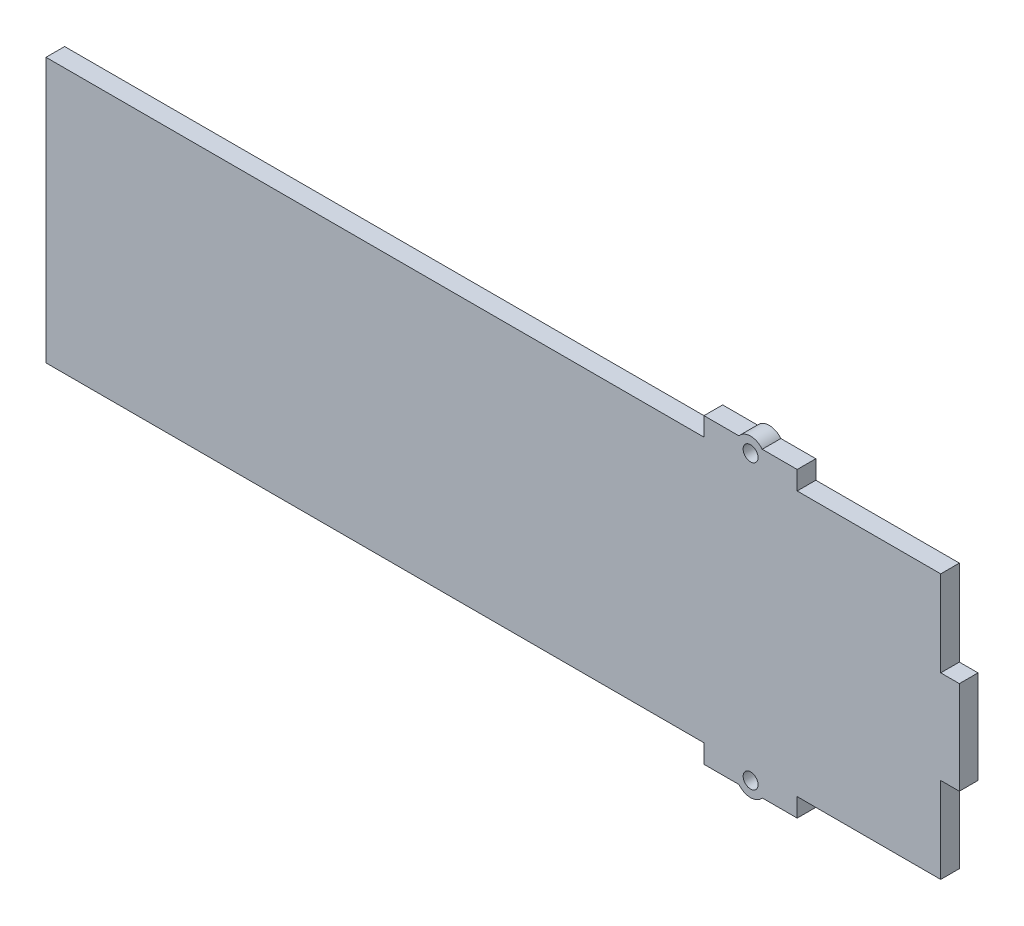
ISO-10303-21;
HEADER;
FILE_DESCRIPTION(('STEP AP214'),'2;1');
FILE_NAME('part.step','',(''),(''),'','','');
FILE_SCHEMA(('AUTOMOTIVE_DESIGN { 1 0 10303 214 1 1 1 1 }'));
ENDSEC;
DATA;
#1=APPLICATION_CONTEXT('core data for automotive mechanical design processes');
#2=APPLICATION_PROTOCOL_DEFINITION('international standard','automotive_design',2000,#1);
#3=PRODUCT_CONTEXT('',#1,'mechanical');
#4=PRODUCT('Part','Part','',(#3));
#5=PRODUCT_RELATED_PRODUCT_CATEGORY('part','',(#4));
#6=PRODUCT_DEFINITION_FORMATION('','',#4);
#7=PRODUCT_DEFINITION_CONTEXT('part definition',#1,'design');
#8=PRODUCT_DEFINITION('design','',#6,#7);
#9=PRODUCT_DEFINITION_SHAPE('','',#8);
#10=(LENGTH_UNIT() NAMED_UNIT(*) SI_UNIT(.MILLI.,.METRE.));
#11=(NAMED_UNIT(*) PLANE_ANGLE_UNIT() SI_UNIT($,.RADIAN.));
#12=(NAMED_UNIT(*) SI_UNIT($,.STERADIAN.) SOLID_ANGLE_UNIT());
#13=UNCERTAINTY_MEASURE_WITH_UNIT(LENGTH_MEASURE(1.E-05),#10,'distance_accuracy_value','');
#14=(GEOMETRIC_REPRESENTATION_CONTEXT(3) GLOBAL_UNCERTAINTY_ASSIGNED_CONTEXT((#13)) GLOBAL_UNIT_ASSIGNED_CONTEXT((#10,
#11,#12)) REPRESENTATION_CONTEXT('',''));
#15=CARTESIAN_POINT('',(0.,0.,0.));
#16=DIRECTION('',(0.,0.,1.));
#17=DIRECTION('',(1.,0.,0.));
#18=AXIS2_PLACEMENT_3D('',#15,#16,#17);
#19=CARTESIAN_POINT('',(12.5,-40.5,0.));
#20=DIRECTION('',(0.,-1.,0.));
#21=DIRECTION('',(0.,0.,-1.));
#22=AXIS2_PLACEMENT_3D('',#19,#20,#21);
#23=PLANE('',#22);
#24=DIRECTION('',(0.,0.,1.));
#25=VECTOR('',#24,1.);
#26=CARTESIAN_POINT('',(3.1224989991992,-40.5,0.));
#27=LINE('',#26,#25);
#28=CARTESIAN_POINT('',(3.1224989991992,-40.5,0.));
#29=VERTEX_POINT('',#28);
#30=CARTESIAN_POINT('',(3.1224989991992,-40.5,5.));
#31=VERTEX_POINT('',#30);
#32=EDGE_CURVE('E11',#29,#31,#27,.T.);
#33=ORIENTED_EDGE('',*,*,#32,.F.);
#34=DIRECTION('',(1.,0.,0.));
#35=VECTOR('',#34,1.);
#36=CARTESIAN_POINT('',(12.5,-40.5,0.));
#37=LINE('',#36,#35);
#38=CARTESIAN_POINT('',(12.5,-40.5,0.));
#39=VERTEX_POINT('',#38);
#40=EDGE_CURVE('E227',#29,#39,#37,.T.);
#41=ORIENTED_EDGE('',*,*,#40,.T.);
#42=DIRECTION('',(0.,0.,1.));
#43=VECTOR('',#42,1.);
#44=CARTESIAN_POINT('',(12.5,-40.5,0.));
#45=LINE('',#44,#43);
#46=CARTESIAN_POINT('',(12.5,-40.5,5.));
#47=VERTEX_POINT('',#46);
#48=EDGE_CURVE('E239',#39,#47,#45,.T.);
#49=ORIENTED_EDGE('',*,*,#48,.T.);
#50=DIRECTION('',(1.,0.,0.));
#51=VECTOR('',#50,1.);
#52=CARTESIAN_POINT('',(12.5,-40.5,5.));
#53=LINE('',#52,#51);
#54=EDGE_CURVE('E237',#31,#47,#53,.T.);
#55=ORIENTED_EDGE('',*,*,#54,.F.);
#56=EDGE_LOOP('',(#33,#41,#49,#55));
#57=FACE_BOUND('',#56,.T.);
#58=ADVANCED_FACE('F33',(#57),#23,.T.);
#59=CARTESIAN_POINT('',(-12.5,40.5,0.));
#60=DIRECTION('',(0.,1.,0.));
#61=DIRECTION('',(0.,0.,1.));
#62=AXIS2_PLACEMENT_3D('',#59,#60,#61);
#63=PLANE('',#62);
#64=DIRECTION('',(0.,0.,1.));
#65=VECTOR('',#64,1.);
#66=CARTESIAN_POINT('',(-3.1224989991992,40.5,0.));
#67=LINE('',#66,#65);
#68=CARTESIAN_POINT('',(-3.1224989991992,40.5,0.));
#69=VERTEX_POINT('',#68);
#70=CARTESIAN_POINT('',(-3.1224989991992,40.5,5.));
#71=VERTEX_POINT('',#70);
#72=EDGE_CURVE('E327',#69,#71,#67,.T.);
#73=ORIENTED_EDGE('',*,*,#72,.F.);
#74=DIRECTION('',(-1.,0.,0.));
#75=VECTOR('',#74,1.);
#76=CARTESIAN_POINT('',(-12.5,40.5,0.));
#77=LINE('',#76,#75);
#78=CARTESIAN_POINT('',(-12.5,40.5,0.));
#79=VERTEX_POINT('',#78);
#80=EDGE_CURVE('E281',#69,#79,#77,.T.);
#81=ORIENTED_EDGE('',*,*,#80,.T.);
#82=DIRECTION('',(0.,0.,1.));
#83=VECTOR('',#82,1.);
#84=CARTESIAN_POINT('',(-12.5,40.5,0.));
#85=LINE('',#84,#83);
#86=CARTESIAN_POINT('',(-12.5,40.5,5.));
#87=VERTEX_POINT('',#86);
#88=EDGE_CURVE('E292',#79,#87,#85,.T.);
#89=ORIENTED_EDGE('',*,*,#88,.T.);
#90=DIRECTION('',(-1.,0.,0.));
#91=VECTOR('',#90,1.);
#92=CARTESIAN_POINT('',(-12.5,40.5,5.));
#93=LINE('',#92,#91);
#94=EDGE_CURVE('E290',#71,#87,#93,.T.);
#95=ORIENTED_EDGE('',*,*,#94,.F.);
#96=EDGE_LOOP('',(#73,#81,#89,#95));
#97=FACE_BOUND('',#96,.T.);
#98=ADVANCED_FACE('F353',(#97),#63,.T.);
#99=CARTESIAN_POINT('',(-51.,-35.5,5.));
#100=DIRECTION('',(0.,1.,0.));
#101=DIRECTION('',(0.,0.,1.));
#102=AXIS2_PLACEMENT_3D('',#99,#100,#101);
#103=PLANE('',#102);
#104=DIRECTION('',(0.,0.,1.));
#105=VECTOR('',#104,1.);
#106=CARTESIAN_POINT('',(12.5,-35.5,0.));
#107=LINE('',#106,#105);
#108=CARTESIAN_POINT('',(12.5,-35.5,0.));
#109=VERTEX_POINT('',#108);
#110=CARTESIAN_POINT('',(12.5,-35.5,5.));
#111=VERTEX_POINT('',#110);
#112=EDGE_CURVE('E231',#109,#111,#107,.T.);
#113=ORIENTED_EDGE('',*,*,#112,.F.);
#114=DIRECTION('',(1.,0.,0.));
#115=VECTOR('',#114,1.);
#116=CARTESIAN_POINT('',(-51.,-35.5,0.));
#117=LINE('',#116,#115);
#118=CARTESIAN_POINT('',(51.,-35.5,0.));
#119=VERTEX_POINT('',#118);
#120=EDGE_CURVE('E295',#109,#119,#117,.T.);
#121=ORIENTED_EDGE('',*,*,#120,.T.);
#122=DIRECTION('',(0.,0.,-1.));
#123=VECTOR('',#122,1.);
#124=CARTESIAN_POINT('',(51.,-35.5,5.));
#125=LINE('',#124,#123);
#126=CARTESIAN_POINT('',(51.,-35.5,5.));
#127=VERTEX_POINT('',#126);
#128=EDGE_CURVE('E322',#127,#119,#125,.T.);
#129=ORIENTED_EDGE('',*,*,#128,.F.);
#130=DIRECTION('',(1.,0.,0.));
#131=VECTOR('',#130,1.);
#132=CARTESIAN_POINT('',(-51.,-35.5,5.));
#133=LINE('',#132,#131);
#134=EDGE_CURVE('E306',#111,#127,#133,.T.);
#135=ORIENTED_EDGE('',*,*,#134,.F.);
#136=EDGE_LOOP('',(#113,#121,#129,#135));
#137=FACE_BOUND('',#136,.T.);
#138=ADVANCED_FACE('F393',(#137),#103,.F.);
#139=CARTESIAN_POINT('',(51.,35.5,5.));
#140=DIRECTION('',(-1.,0.,0.));
#141=DIRECTION('',(0.,-1.,0.));
#142=AXIS2_PLACEMENT_3D('',#139,#140,#141);
#143=PLANE('',#142);
#144=DIRECTION('',(0.,0.,1.));
#145=VECTOR('',#144,1.);
#146=CARTESIAN_POINT('',(51.,12.5,0.));
#147=LINE('',#146,#145);
#148=CARTESIAN_POINT('',(51.,12.5,0.));
#149=VERTEX_POINT('',#148);
#150=CARTESIAN_POINT('',(51.,12.5,5.));
#151=VERTEX_POINT('',#150);
#152=EDGE_CURVE('E266',#149,#151,#147,.T.);
#153=ORIENTED_EDGE('',*,*,#152,.F.);
#154=DIRECTION('',(0.,1.,0.));
#155=VECTOR('',#154,1.);
#156=CARTESIAN_POINT('',(51.,35.5,0.));
#157=LINE('',#156,#155);
#158=CARTESIAN_POINT('',(51.,35.5,0.));
#159=VERTEX_POINT('',#158);
#160=EDGE_CURVE('E316',#149,#159,#157,.T.);
#161=ORIENTED_EDGE('',*,*,#160,.T.);
#162=DIRECTION('',(0.,0.,-1.));
#163=VECTOR('',#162,1.);
#164=CARTESIAN_POINT('',(51.,35.5,5.));
#165=LINE('',#164,#163);
#166=CARTESIAN_POINT('',(51.,35.5,5.));
#167=VERTEX_POINT('',#166);
#168=EDGE_CURVE('E314',#167,#159,#165,.T.);
#169=ORIENTED_EDGE('',*,*,#168,.F.);
#170=DIRECTION('',(0.,1.,0.));
#171=VECTOR('',#170,1.);
#172=CARTESIAN_POINT('',(51.,35.5,5.));
#173=LINE('',#172,#171);
#174=EDGE_CURVE('E305',#151,#167,#173,.T.);
#175=ORIENTED_EDGE('',*,*,#174,.F.);
#176=EDGE_LOOP('',(#153,#161,#169,#175));
#177=FACE_BOUND('',#176,.T.);
#178=ADVANCED_FACE('F373',(#177),#143,.F.);
#179=CARTESIAN_POINT('',(-51.,35.5,5.));
#180=DIRECTION('',(0.,-1.,0.));
#181=DIRECTION('',(1.,0.,0.));
#182=AXIS2_PLACEMENT_3D('',#179,#180,#181);
#183=PLANE('',#182);
#184=DIRECTION('',(0.,0.,1.));
#185=VECTOR('',#184,1.);
#186=CARTESIAN_POINT('',(-12.5,35.5,0.));
#187=LINE('',#186,#185);
#188=CARTESIAN_POINT('',(-12.5,35.5,0.));
#189=VERTEX_POINT('',#188);
#190=CARTESIAN_POINT('',(-12.5,35.5,5.));
#191=VERTEX_POINT('',#190);
#192=EDGE_CURVE('E175',#189,#191,#187,.T.);
#193=ORIENTED_EDGE('',*,*,#192,.F.);
#194=DIRECTION('',(-1.,0.,0.));
#195=VECTOR('',#194,1.);
#196=CARTESIAN_POINT('',(-51.,35.5,0.));
#197=LINE('',#196,#195);
#198=CARTESIAN_POINT('',(-189.,35.5,0.));
#199=VERTEX_POINT('',#198);
#200=EDGE_CURVE('E169',#189,#199,#197,.T.);
#201=ORIENTED_EDGE('',*,*,#200,.T.);
#202=DIRECTION('',(0.,0.,1.));
#203=VECTOR('',#202,1.);
#204=CARTESIAN_POINT('',(-189.,35.5,0.));
#205=LINE('',#204,#203);
#206=CARTESIAN_POINT('',(-189.,35.5,5.));
#207=VERTEX_POINT('',#206);
#208=EDGE_CURVE('E173',#199,#207,#205,.T.);
#209=ORIENTED_EDGE('',*,*,#208,.T.);
#210=DIRECTION('',(-1.,0.,0.));
#211=VECTOR('',#210,1.);
#212=CARTESIAN_POINT('',(-51.,35.5,5.));
#213=LINE('',#212,#211);
#214=EDGE_CURVE('E310',#191,#207,#213,.T.);
#215=ORIENTED_EDGE('',*,*,#214,.F.);
#216=EDGE_LOOP('',(#193,#201,#209,#215));
#217=FACE_BOUND('',#216,.T.);
#218=ADVANCED_FACE('F171',(#217),#183,.F.);
#219=CARTESIAN_POINT('',(-189.,-35.5,0.));
#220=VERTEX_POINT('',#219);
#221=CARTESIAN_POINT('',(-12.5,-35.5,0.));
#222=VERTEX_POINT('',#221);
#223=EDGE_CURVE('E196',#220,#222,#117,.T.);
#224=ORIENTED_EDGE('',*,*,#223,.T.);
#225=DIRECTION('',(0.,0.,1.));
#226=VECTOR('',#225,1.);
#227=CARTESIAN_POINT('',(-12.5,-35.5,0.));
#228=LINE('',#227,#226);
#229=CARTESIAN_POINT('',(-12.5,-35.5,5.));
#230=VERTEX_POINT('',#229);
#231=EDGE_CURVE('E245',#222,#230,#228,.T.);
#232=ORIENTED_EDGE('',*,*,#231,.T.);
#233=CARTESIAN_POINT('',(-189.,-35.5,5.));
#234=VERTEX_POINT('',#233);
#235=EDGE_CURVE('E302',#234,#230,#133,.T.);
#236=ORIENTED_EDGE('',*,*,#235,.F.);
#237=DIRECTION('',(0.,0.,1.));
#238=VECTOR('',#237,1.);
#239=CARTESIAN_POINT('',(-189.,-35.5,0.));
#240=LINE('',#239,#238);
#241=EDGE_CURVE('E189',#220,#234,#240,.T.);
#242=ORIENTED_EDGE('',*,*,#241,.F.);
#243=EDGE_LOOP('',(#224,#232,#236,#242));
#244=FACE_BOUND('',#243,.T.);
#245=ADVANCED_FACE('F35',(#244),#103,.F.);
#246=CARTESIAN_POINT('',(51.,-12.5,0.));
#247=VERTEX_POINT('',#246);
#248=EDGE_CURVE('E180',#119,#247,#157,.T.);
#249=ORIENTED_EDGE('',*,*,#248,.T.);
#250=DIRECTION('',(0.,0.,1.));
#251=VECTOR('',#250,1.);
#252=CARTESIAN_POINT('',(51.,-12.5,0.));
#253=LINE('',#252,#251);
#254=CARTESIAN_POINT('',(51.,-12.5,5.));
#255=VERTEX_POINT('',#254);
#256=EDGE_CURVE('E258',#247,#255,#253,.T.);
#257=ORIENTED_EDGE('',*,*,#256,.T.);
#258=EDGE_CURVE('E307',#127,#255,#173,.T.);
#259=ORIENTED_EDGE('',*,*,#258,.F.);
#260=ORIENTED_EDGE('',*,*,#128,.T.);
#261=EDGE_LOOP('',(#249,#257,#259,#260));
#262=FACE_BOUND('',#261,.T.);
#263=ADVANCED_FACE('F387',(#262),#143,.F.);
#264=CARTESIAN_POINT('',(12.5,35.5,0.));
#265=VERTEX_POINT('',#264);
#266=EDGE_CURVE('E179',#159,#265,#197,.T.);
#267=ORIENTED_EDGE('',*,*,#266,.T.);
#268=DIRECTION('',(0.,0.,1.));
#269=VECTOR('',#268,1.);
#270=CARTESIAN_POINT('',(12.5,35.5,0.));
#271=LINE('',#270,#269);
#272=CARTESIAN_POINT('',(12.5,35.5,5.));
#273=VERTEX_POINT('',#272);
#274=EDGE_CURVE('E298',#265,#273,#271,.T.);
#275=ORIENTED_EDGE('',*,*,#274,.T.);
#276=EDGE_CURVE('E311',#167,#273,#213,.T.);
#277=ORIENTED_EDGE('',*,*,#276,.F.);
#278=ORIENTED_EDGE('',*,*,#168,.T.);
#279=EDGE_LOOP('',(#267,#275,#277,#278));
#280=FACE_BOUND('',#279,.T.);
#281=ADVANCED_FACE('F365',(#280),#183,.F.);
#282=CARTESIAN_POINT('',(0.,0.,5.));
#283=DIRECTION('',(0.,0.,1.));
#284=DIRECTION('',(1.,0.,0.));
#285=AXIS2_PLACEMENT_3D('',#282,#283,#284);
#286=PLANE('',#285);
#287=CARTESIAN_POINT('',(-12.5,-40.5,5.));
#288=VERTEX_POINT('',#287);
#289=CARTESIAN_POINT('',(-3.1224989991992,-40.5,5.));
#290=VERTEX_POINT('',#289);
#291=EDGE_CURVE('E224',#288,#290,#53,.T.);
#292=ORIENTED_EDGE('',*,*,#291,.T.);
#293=CARTESIAN_POINT('',(0.,-38.,5.));
#294=DIRECTION('',(0.,0.,1.));
#295=DIRECTION('',(1.,0.,0.));
#296=AXIS2_PLACEMENT_3D('',#293,#294,#295);
#297=CIRCLE('',#296,4.);
#298=EDGE_CURVE('E48',#290,#31,#297,.T.);
#299=ORIENTED_EDGE('',*,*,#298,.T.);
#300=ORIENTED_EDGE('',*,*,#54,.T.);
#301=DIRECTION('',(0.,1.,0.));
#302=VECTOR('',#301,1.);
#303=CARTESIAN_POINT('',(12.5,-35.5,5.));
#304=LINE('',#303,#302);
#305=EDGE_CURVE('E212',#47,#111,#304,.T.);
#306=ORIENTED_EDGE('',*,*,#305,.T.);
#307=ORIENTED_EDGE('',*,*,#134,.T.);
#308=ORIENTED_EDGE('',*,*,#258,.T.);
#309=DIRECTION('',(1.,0.,0.));
#310=VECTOR('',#309,1.);
#311=CARTESIAN_POINT('',(56.,-12.5,5.));
#312=LINE('',#311,#310);
#313=CARTESIAN_POINT('',(56.,-12.5,5.));
#314=VERTEX_POINT('',#313);
#315=EDGE_CURVE('E242',#255,#314,#312,.T.);
#316=ORIENTED_EDGE('',*,*,#315,.T.);
#317=DIRECTION('',(0.,1.,0.));
#318=VECTOR('',#317,1.);
#319=CARTESIAN_POINT('',(56.,12.5,5.));
#320=LINE('',#319,#318);
#321=CARTESIAN_POINT('',(56.,12.5,5.));
#322=VERTEX_POINT('',#321);
#323=EDGE_CURVE('E261',#314,#322,#320,.T.);
#324=ORIENTED_EDGE('',*,*,#323,.T.);
#325=DIRECTION('',(-1.,0.,0.));
#326=VECTOR('',#325,1.);
#327=CARTESIAN_POINT('',(51.,12.5,5.));
#328=LINE('',#327,#326);
#329=EDGE_CURVE('E253',#322,#151,#328,.T.);
#330=ORIENTED_EDGE('',*,*,#329,.T.);
#331=ORIENTED_EDGE('',*,*,#174,.T.);
#332=ORIENTED_EDGE('',*,*,#276,.T.);
#333=DIRECTION('',(0.,1.,0.));
#334=VECTOR('',#333,1.);
#335=CARTESIAN_POINT('',(12.5,35.5,5.));
#336=LINE('',#335,#334);
#337=CARTESIAN_POINT('',(12.5,40.5,5.));
#338=VERTEX_POINT('',#337);
#339=EDGE_CURVE('E287',#273,#338,#336,.T.);
#340=ORIENTED_EDGE('',*,*,#339,.T.);
#341=CARTESIAN_POINT('',(3.1224989991992,40.5,5.));
#342=VERTEX_POINT('',#341);
#343=EDGE_CURVE('E278',#338,#342,#93,.T.);
#344=ORIENTED_EDGE('',*,*,#343,.T.);
#345=CARTESIAN_POINT('',(0.,38.,5.));
#346=DIRECTION('',(0.,0.,1.));
#347=DIRECTION('',(1.,0.,0.));
#348=AXIS2_PLACEMENT_3D('',#345,#346,#347);
#349=CIRCLE('',#348,4.);
#350=EDGE_CURVE('E54',#342,#71,#349,.T.);
#351=ORIENTED_EDGE('',*,*,#350,.T.);
#352=ORIENTED_EDGE('',*,*,#94,.T.);
#353=DIRECTION('',(0.,-1.,0.));
#354=VECTOR('',#353,1.);
#355=CARTESIAN_POINT('',(-12.5,35.5,5.));
#356=LINE('',#355,#354);
#357=EDGE_CURVE('E268',#87,#191,#356,.T.);
#358=ORIENTED_EDGE('',*,*,#357,.T.);
#359=ORIENTED_EDGE('',*,*,#214,.T.);
#360=DIRECTION('',(0.,-1.,0.));
#361=VECTOR('',#360,1.);
#362=CARTESIAN_POINT('',(-189.,35.5,5.));
#363=LINE('',#362,#361);
#364=EDGE_CURVE('E188',#207,#234,#363,.T.);
#365=ORIENTED_EDGE('',*,*,#364,.T.);
#366=ORIENTED_EDGE('',*,*,#235,.T.);
#367=DIRECTION('',(0.,-1.,0.));
#368=VECTOR('',#367,1.);
#369=CARTESIAN_POINT('',(-12.5,-35.5,5.));
#370=LINE('',#369,#368);
#371=EDGE_CURVE('E234',#230,#288,#370,.T.);
#372=ORIENTED_EDGE('',*,*,#371,.T.);
#373=EDGE_LOOP('',(#292,#299,#300,#306,#307,#308,#316,#324,#330,#331,#332,#340,#344,#351,#352,
#358,#359,#365,#366,#372));
#374=FACE_BOUND('',#373,.T.);
#375=CARTESIAN_POINT('',(0.,38.,5.));
#376=DIRECTION('',(0.,0.,1.));
#377=DIRECTION('',(1.,0.,0.));
#378=AXIS2_PLACEMENT_3D('',#375,#376,#377);
#379=CIRCLE('',#378,2.);
#380=CARTESIAN_POINT('',(2.,38.,5.));
#381=VERTEX_POINT('',#380);
#382=EDGE_CURVE('E213',#381,#381,#379,.T.);
#383=ORIENTED_EDGE('',*,*,#382,.F.);
#384=EDGE_LOOP('',(#383));
#385=FACE_BOUND('',#384,.T.);
#386=CARTESIAN_POINT('',(0.,-38.,5.));
#387=DIRECTION('',(0.,0.,1.));
#388=DIRECTION('',(1.,0.,0.));
#389=AXIS2_PLACEMENT_3D('',#386,#387,#388);
#390=CIRCLE('',#389,2.);
#391=CARTESIAN_POINT('',(2.,-38.,5.));
#392=VERTEX_POINT('',#391);
#393=EDGE_CURVE('E207',#392,#392,#390,.T.);
#394=ORIENTED_EDGE('',*,*,#393,.F.);
#395=EDGE_LOOP('',(#394));
#396=FACE_BOUND('',#395,.T.);
#397=ADVANCED_FACE('F341',(#374,#385,#396),#286,.T.);
#398=CARTESIAN_POINT('',(0.,0.,0.));
#399=DIRECTION('',(0.,0.,1.));
#400=DIRECTION('',(1.,0.,0.));
#401=AXIS2_PLACEMENT_3D('',#398,#399,#400);
#402=PLANE('',#401);
#403=ORIENTED_EDGE('',*,*,#40,.F.);
#404=CARTESIAN_POINT('',(0.,-38.,0.));
#405=DIRECTION('',(0.,0.,1.));
#406=DIRECTION('',(1.,0.,0.));
#407=AXIS2_PLACEMENT_3D('',#404,#405,#406);
#408=CIRCLE('',#407,4.);
#409=CARTESIAN_POINT('',(-3.1224989991992,-40.5,0.));
#410=VERTEX_POINT('',#409);
#411=EDGE_CURVE('E202',#410,#29,#408,.T.);
#412=ORIENTED_EDGE('',*,*,#411,.F.);
#413=CARTESIAN_POINT('',(-12.5,-40.5,0.));
#414=VERTEX_POINT('',#413);
#415=EDGE_CURVE('E228',#414,#410,#37,.T.);
#416=ORIENTED_EDGE('',*,*,#415,.F.);
#417=DIRECTION('',(0.,-1.,0.));
#418=VECTOR('',#417,1.);
#419=CARTESIAN_POINT('',(-12.5,-35.5,0.));
#420=LINE('',#419,#418);
#421=EDGE_CURVE('E223',#222,#414,#420,.T.);
#422=ORIENTED_EDGE('',*,*,#421,.F.);
#423=ORIENTED_EDGE('',*,*,#223,.F.);
#424=DIRECTION('',(0.,-1.,0.));
#425=VECTOR('',#424,1.);
#426=CARTESIAN_POINT('',(-189.,35.5,0.));
#427=LINE('',#426,#425);
#428=EDGE_CURVE('E186',#199,#220,#427,.T.);
#429=ORIENTED_EDGE('',*,*,#428,.F.);
#430=ORIENTED_EDGE('',*,*,#200,.F.);
#431=DIRECTION('',(0.,-1.,0.));
#432=VECTOR('',#431,1.);
#433=CARTESIAN_POINT('',(-12.5,35.5,0.));
#434=LINE('',#433,#432);
#435=EDGE_CURVE('E275',#79,#189,#434,.T.);
#436=ORIENTED_EDGE('',*,*,#435,.F.);
#437=ORIENTED_EDGE('',*,*,#80,.F.);
#438=CARTESIAN_POINT('',(0.,38.,0.));
#439=DIRECTION('',(0.,0.,1.));
#440=DIRECTION('',(1.,0.,0.));
#441=AXIS2_PLACEMENT_3D('',#438,#439,#440);
#442=CIRCLE('',#441,4.);
#443=CARTESIAN_POINT('',(3.1224989991992,40.5,0.));
#444=VERTEX_POINT('',#443);
#445=EDGE_CURVE('E205',#444,#69,#442,.T.);
#446=ORIENTED_EDGE('',*,*,#445,.F.);
#447=CARTESIAN_POINT('',(12.5,40.5,0.));
#448=VERTEX_POINT('',#447);
#449=EDGE_CURVE('E282',#448,#444,#77,.T.);
#450=ORIENTED_EDGE('',*,*,#449,.F.);
#451=DIRECTION('',(0.,1.,0.));
#452=VECTOR('',#451,1.);
#453=CARTESIAN_POINT('',(12.5,35.5,0.));
#454=LINE('',#453,#452);
#455=EDGE_CURVE('E277',#265,#448,#454,.T.);
#456=ORIENTED_EDGE('',*,*,#455,.F.);
#457=ORIENTED_EDGE('',*,*,#266,.F.);
#458=ORIENTED_EDGE('',*,*,#160,.F.);
#459=DIRECTION('',(-1.,0.,0.));
#460=VECTOR('',#459,1.);
#461=CARTESIAN_POINT('',(51.,12.5,0.));
#462=LINE('',#461,#460);
#463=CARTESIAN_POINT('',(56.,12.5,0.));
#464=VERTEX_POINT('',#463);
#465=EDGE_CURVE('E256',#464,#149,#462,.T.);
#466=ORIENTED_EDGE('',*,*,#465,.F.);
#467=DIRECTION('',(0.,1.,0.));
#468=VECTOR('',#467,1.);
#469=CARTESIAN_POINT('',(56.,12.5,0.));
#470=LINE('',#469,#468);
#471=CARTESIAN_POINT('',(56.,-12.5,0.));
#472=VERTEX_POINT('',#471);
#473=EDGE_CURVE('E252',#472,#464,#470,.T.);
#474=ORIENTED_EDGE('',*,*,#473,.F.);
#475=DIRECTION('',(1.,0.,0.));
#476=VECTOR('',#475,1.);
#477=CARTESIAN_POINT('',(56.,-12.5,0.));
#478=LINE('',#477,#476);
#479=EDGE_CURVE('E249',#247,#472,#478,.T.);
#480=ORIENTED_EDGE('',*,*,#479,.F.);
#481=ORIENTED_EDGE('',*,*,#248,.F.);
#482=ORIENTED_EDGE('',*,*,#120,.F.);
#483=DIRECTION('',(0.,1.,0.));
#484=VECTOR('',#483,1.);
#485=CARTESIAN_POINT('',(12.5,-35.5,0.));
#486=LINE('',#485,#484);
#487=EDGE_CURVE('E221',#39,#109,#486,.T.);
#488=ORIENTED_EDGE('',*,*,#487,.F.);
#489=EDGE_LOOP('',(#403,#412,#416,#422,#423,#429,#430,#436,#437,#446,#450,#456,#457,#458,#466,
#474,#480,#481,#482,#488));
#490=FACE_BOUND('',#489,.T.);
#491=CARTESIAN_POINT('',(0.,38.,0.));
#492=DIRECTION('',(0.,0.,1.));
#493=DIRECTION('',(1.,0.,0.));
#494=AXIS2_PLACEMENT_3D('',#491,#492,#493);
#495=CIRCLE('',#494,2.);
#496=CARTESIAN_POINT('',(2.,38.,0.));
#497=VERTEX_POINT('',#496);
#498=EDGE_CURVE('E209',#497,#497,#495,.T.);
#499=ORIENTED_EDGE('',*,*,#498,.T.);
#500=EDGE_LOOP('',(#499));
#501=FACE_BOUND('',#500,.T.);
#502=CARTESIAN_POINT('',(0.,-38.,0.));
#503=DIRECTION('',(0.,0.,1.));
#504=DIRECTION('',(1.,0.,0.));
#505=AXIS2_PLACEMENT_3D('',#502,#503,#504);
#506=CIRCLE('',#505,2.);
#507=CARTESIAN_POINT('',(2.,-38.,0.));
#508=VERTEX_POINT('',#507);
#509=EDGE_CURVE('E216',#508,#508,#506,.T.);
#510=ORIENTED_EDGE('',*,*,#509,.T.);
#511=EDGE_LOOP('',(#510));
#512=FACE_BOUND('',#511,.T.);
#513=ADVANCED_FACE('F192',(#490,#501,#512),#402,.F.);
#514=CARTESIAN_POINT('',(-12.5,35.5,0.));
#515=DIRECTION('',(-1.,0.,0.));
#516=DIRECTION('',(0.,-1.,0.));
#517=AXIS2_PLACEMENT_3D('',#514,#515,#516);
#518=PLANE('',#517);
#519=ORIENTED_EDGE('',*,*,#357,.F.);
#520=ORIENTED_EDGE('',*,*,#88,.F.);
#521=ORIENTED_EDGE('',*,*,#435,.T.);
#522=ORIENTED_EDGE('',*,*,#192,.T.);
#523=EDGE_LOOP('',(#519,#520,#521,#522));
#524=FACE_BOUND('',#523,.T.);
#525=ADVANCED_FACE('F347',(#524),#518,.T.);
#526=DIRECTION('',(0.,0.,1.));
#527=VECTOR('',#526,1.);
#528=CARTESIAN_POINT('',(3.1224989991992,40.5,0.));
#529=LINE('',#528,#527);
#530=EDGE_CURVE('E325',#342,#444,#529,.F.);
#531=ORIENTED_EDGE('',*,*,#530,.F.);
#532=ORIENTED_EDGE('',*,*,#343,.F.);
#533=DIRECTION('',(0.,0.,1.));
#534=VECTOR('',#533,1.);
#535=CARTESIAN_POINT('',(12.5,40.5,0.));
#536=LINE('',#535,#534);
#537=EDGE_CURVE('E296',#448,#338,#536,.T.);
#538=ORIENTED_EDGE('',*,*,#537,.F.);
#539=ORIENTED_EDGE('',*,*,#449,.T.);
#540=EDGE_LOOP('',(#531,#532,#538,#539));
#541=FACE_BOUND('',#540,.T.);
#542=ADVANCED_FACE('F359',(#541),#63,.T.);
#543=CARTESIAN_POINT('',(12.5,35.5,0.));
#544=DIRECTION('',(1.,0.,0.));
#545=DIRECTION('',(0.,0.,-1.));
#546=AXIS2_PLACEMENT_3D('',#543,#544,#545);
#547=PLANE('',#546);
#548=ORIENTED_EDGE('',*,*,#339,.F.);
#549=ORIENTED_EDGE('',*,*,#274,.F.);
#550=ORIENTED_EDGE('',*,*,#455,.T.);
#551=ORIENTED_EDGE('',*,*,#537,.T.);
#552=EDGE_LOOP('',(#548,#549,#550,#551));
#553=FACE_BOUND('',#552,.T.);
#554=ADVANCED_FACE('F362',(#553),#547,.T.);
#555=CARTESIAN_POINT('',(51.,12.5,0.));
#556=DIRECTION('',(0.,1.,0.));
#557=DIRECTION('',(0.,0.,1.));
#558=AXIS2_PLACEMENT_3D('',#555,#556,#557);
#559=PLANE('',#558);
#560=ORIENTED_EDGE('',*,*,#329,.F.);
#561=DIRECTION('',(0.,0.,1.));
#562=VECTOR('',#561,1.);
#563=CARTESIAN_POINT('',(56.,12.5,0.));
#564=LINE('',#563,#562);
#565=EDGE_CURVE('E269',#464,#322,#564,.T.);
#566=ORIENTED_EDGE('',*,*,#565,.F.);
#567=ORIENTED_EDGE('',*,*,#465,.T.);
#568=ORIENTED_EDGE('',*,*,#152,.T.);
#569=EDGE_LOOP('',(#560,#566,#567,#568));
#570=FACE_BOUND('',#569,.T.);
#571=ADVANCED_FACE('F377',(#570),#559,.T.);
#572=CARTESIAN_POINT('',(56.,12.5,0.));
#573=DIRECTION('',(1.,0.,0.));
#574=DIRECTION('',(0.,1.,0.));
#575=AXIS2_PLACEMENT_3D('',#572,#573,#574);
#576=PLANE('',#575);
#577=ORIENTED_EDGE('',*,*,#323,.F.);
#578=DIRECTION('',(0.,0.,1.));
#579=VECTOR('',#578,1.);
#580=CARTESIAN_POINT('',(56.,-12.5,0.));
#581=LINE('',#580,#579);
#582=EDGE_CURVE('E271',#472,#314,#581,.T.);
#583=ORIENTED_EDGE('',*,*,#582,.F.);
#584=ORIENTED_EDGE('',*,*,#473,.T.);
#585=ORIENTED_EDGE('',*,*,#565,.T.);
#586=EDGE_LOOP('',(#577,#583,#584,#585));
#587=FACE_BOUND('',#586,.T.);
#588=ADVANCED_FACE('F380',(#587),#576,.T.);
#589=CARTESIAN_POINT('',(56.,-12.5,0.));
#590=DIRECTION('',(0.,-1.,0.));
#591=DIRECTION('',(0.,0.,-1.));
#592=AXIS2_PLACEMENT_3D('',#589,#590,#591);
#593=PLANE('',#592);
#594=ORIENTED_EDGE('',*,*,#315,.F.);
#595=ORIENTED_EDGE('',*,*,#256,.F.);
#596=ORIENTED_EDGE('',*,*,#479,.T.);
#597=ORIENTED_EDGE('',*,*,#582,.T.);
#598=EDGE_LOOP('',(#594,#595,#596,#597));
#599=FACE_BOUND('',#598,.T.);
#600=ADVANCED_FACE('F384',(#599),#593,.T.);
#601=CARTESIAN_POINT('',(12.5,-35.5,0.));
#602=DIRECTION('',(1.,0.,0.));
#603=DIRECTION('',(0.,0.,-1.));
#604=AXIS2_PLACEMENT_3D('',#601,#602,#603);
#605=PLANE('',#604);
#606=ORIENTED_EDGE('',*,*,#305,.F.);
#607=ORIENTED_EDGE('',*,*,#48,.F.);
#608=ORIENTED_EDGE('',*,*,#487,.T.);
#609=ORIENTED_EDGE('',*,*,#112,.T.);
#610=EDGE_LOOP('',(#606,#607,#608,#609));
#611=FACE_BOUND('',#610,.T.);
#612=ADVANCED_FACE('F397',(#611),#605,.T.);
#613=DIRECTION('',(0.,0.,1.));
#614=VECTOR('',#613,1.);
#615=CARTESIAN_POINT('',(-3.1224989991992,-40.5,0.));
#616=LINE('',#615,#614);
#617=EDGE_CURVE('E41',#290,#410,#616,.F.);
#618=ORIENTED_EDGE('',*,*,#617,.F.);
#619=ORIENTED_EDGE('',*,*,#291,.F.);
#620=DIRECTION('',(0.,0.,1.));
#621=VECTOR('',#620,1.);
#622=CARTESIAN_POINT('',(-12.5,-40.5,0.));
#623=LINE('',#622,#621);
#624=EDGE_CURVE('E243',#414,#288,#623,.T.);
#625=ORIENTED_EDGE('',*,*,#624,.F.);
#626=ORIENTED_EDGE('',*,*,#415,.T.);
#627=EDGE_LOOP('',(#618,#619,#625,#626));
#628=FACE_BOUND('',#627,.T.);
#629=ADVANCED_FACE('F337',(#628),#23,.T.);
#630=CARTESIAN_POINT('',(-12.5,-35.5,0.));
#631=DIRECTION('',(-1.,0.,0.));
#632=DIRECTION('',(0.,0.,1.));
#633=AXIS2_PLACEMENT_3D('',#630,#631,#632);
#634=PLANE('',#633);
#635=ORIENTED_EDGE('',*,*,#371,.F.);
#636=ORIENTED_EDGE('',*,*,#231,.F.);
#637=ORIENTED_EDGE('',*,*,#421,.T.);
#638=ORIENTED_EDGE('',*,*,#624,.T.);
#639=EDGE_LOOP('',(#635,#636,#637,#638));
#640=FACE_BOUND('',#639,.T.);
#641=ADVANCED_FACE('F339',(#640),#634,.T.);
#642=CARTESIAN_POINT('',(0.,-38.,0.));
#643=DIRECTION('',(0.,0.,1.));
#644=DIRECTION('',(1.,0.,0.));
#645=AXIS2_PLACEMENT_3D('',#642,#643,#644);
#646=CYLINDRICAL_SURFACE('',#645,2.);
#647=ORIENTED_EDGE('',*,*,#509,.F.);
#648=EDGE_LOOP('',(#647));
#649=FACE_BOUND('',#648,.T.);
#650=ORIENTED_EDGE('',*,*,#393,.T.);
#651=EDGE_LOOP('',(#650));
#652=FACE_BOUND('',#651,.T.);
#653=ADVANCED_FACE('F413',(#649,#652),#646,.F.);
#654=CARTESIAN_POINT('',(0.,38.,0.));
#655=DIRECTION('',(0.,0.,1.));
#656=DIRECTION('',(1.,0.,0.));
#657=AXIS2_PLACEMENT_3D('',#654,#655,#656);
#658=CYLINDRICAL_SURFACE('',#657,2.);
#659=ORIENTED_EDGE('',*,*,#498,.F.);
#660=EDGE_LOOP('',(#659));
#661=FACE_BOUND('',#660,.T.);
#662=ORIENTED_EDGE('',*,*,#382,.T.);
#663=EDGE_LOOP('',(#662));
#664=FACE_BOUND('',#663,.T.);
#665=ADVANCED_FACE('F476',(#661,#664),#658,.F.);
#666=CARTESIAN_POINT('',(0.,38.,0.));
#667=DIRECTION('',(0.,0.,1.));
#668=DIRECTION('',(1.,0.,0.));
#669=AXIS2_PLACEMENT_3D('',#666,#667,#668);
#670=CYLINDRICAL_SURFACE('',#669,4.);
#671=ORIENTED_EDGE('',*,*,#445,.T.);
#672=ORIENTED_EDGE('',*,*,#72,.T.);
#673=ORIENTED_EDGE('',*,*,#350,.F.);
#674=ORIENTED_EDGE('',*,*,#530,.T.);
#675=EDGE_LOOP('',(#671,#672,#673,#674));
#676=FACE_BOUND('',#675,.T.);
#677=ADVANCED_FACE('F355',(#676),#670,.T.);
#678=CARTESIAN_POINT('',(0.,-38.,0.));
#679=DIRECTION('',(0.,0.,1.));
#680=DIRECTION('',(1.,0.,0.));
#681=AXIS2_PLACEMENT_3D('',#678,#679,#680);
#682=CYLINDRICAL_SURFACE('',#681,4.);
#683=ORIENTED_EDGE('',*,*,#411,.T.);
#684=ORIENTED_EDGE('',*,*,#32,.T.);
#685=ORIENTED_EDGE('',*,*,#298,.F.);
#686=ORIENTED_EDGE('',*,*,#617,.T.);
#687=EDGE_LOOP('',(#683,#684,#685,#686));
#688=FACE_BOUND('',#687,.T.);
#689=ADVANCED_FACE('F331',(#688),#682,.T.);
#690=CARTESIAN_POINT('',(-189.,35.5,0.));
#691=DIRECTION('',(-1.,0.,0.));
#692=DIRECTION('',(0.,0.,1.));
#693=AXIS2_PLACEMENT_3D('',#690,#691,#692);
#694=PLANE('',#693);
#695=ORIENTED_EDGE('',*,*,#364,.F.);
#696=ORIENTED_EDGE('',*,*,#208,.F.);
#697=ORIENTED_EDGE('',*,*,#428,.T.);
#698=ORIENTED_EDGE('',*,*,#241,.T.);
#699=EDGE_LOOP('',(#695,#696,#697,#698));
#700=FACE_BOUND('',#699,.T.);
#701=ADVANCED_FACE('F184',(#700),#694,.T.);
#702=CLOSED_SHELL('',(#58,#98,#138,#178,#218,#245,#263,#281,#397,#513,#525,#542,#554,#571,#588,
#600,#612,#629,#641,#653,#665,#677,#689,#701));
#703=MANIFOLD_SOLID_BREP('B2',#702);
#704=ADVANCED_BREP_SHAPE_REPRESENTATION('',(#18,#703),#14);
#705=SHAPE_DEFINITION_REPRESENTATION(#9,#704);
ENDSEC;
END-ISO-10303-21;
